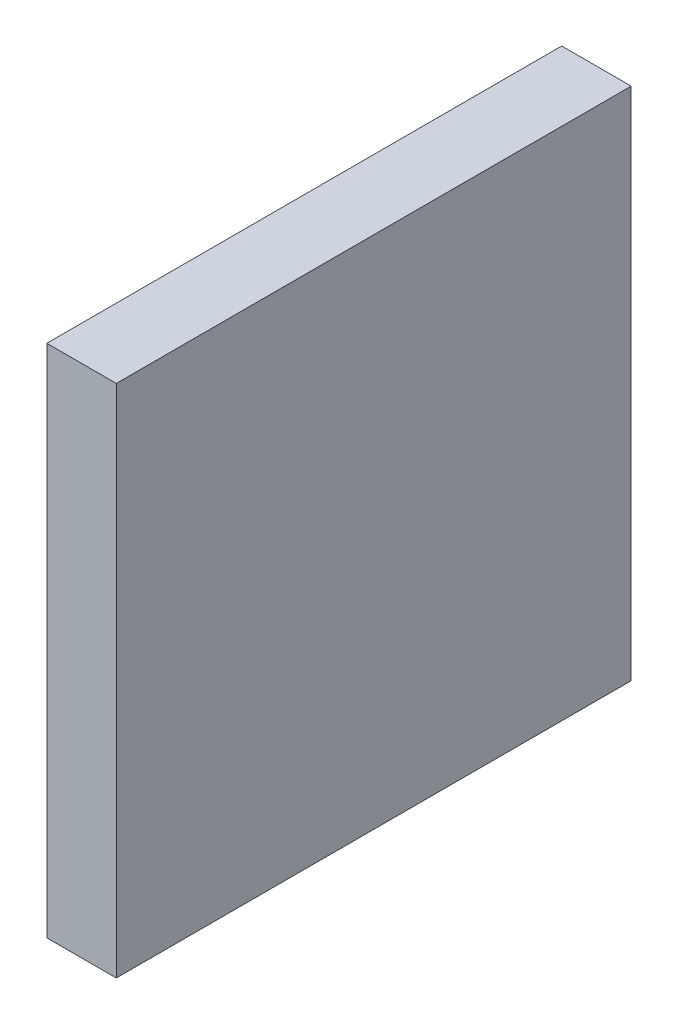
ISO-10303-21;
HEADER;
FILE_DESCRIPTION(('STEP AP214'),'2;1');
FILE_NAME('part.step','',(''),(''),'','','');
FILE_SCHEMA(('AUTOMOTIVE_DESIGN { 1 0 10303 214 1 1 1 1 }'));
ENDSEC;
DATA;
#1=APPLICATION_CONTEXT('core data for automotive mechanical design processes');
#2=APPLICATION_PROTOCOL_DEFINITION('international standard','automotive_design',2000,#1);
#3=PRODUCT_CONTEXT('',#1,'mechanical');
#4=PRODUCT('Part','Part','',(#3));
#5=PRODUCT_RELATED_PRODUCT_CATEGORY('part','',(#4));
#6=PRODUCT_DEFINITION_FORMATION('','',#4);
#7=PRODUCT_DEFINITION_CONTEXT('part definition',#1,'design');
#8=PRODUCT_DEFINITION('design','',#6,#7);
#9=PRODUCT_DEFINITION_SHAPE('','',#8);
#10=(LENGTH_UNIT() NAMED_UNIT(*) SI_UNIT(.MILLI.,.METRE.));
#11=(NAMED_UNIT(*) PLANE_ANGLE_UNIT() SI_UNIT($,.RADIAN.));
#12=(NAMED_UNIT(*) SI_UNIT($,.STERADIAN.) SOLID_ANGLE_UNIT());
#13=UNCERTAINTY_MEASURE_WITH_UNIT(LENGTH_MEASURE(1.E-05),#10,'distance_accuracy_value','');
#14=(GEOMETRIC_REPRESENTATION_CONTEXT(3) GLOBAL_UNCERTAINTY_ASSIGNED_CONTEXT((#13)) GLOBAL_UNIT_ASSIGNED_CONTEXT((#10,
#11,#12)) REPRESENTATION_CONTEXT('',''));
#15=CARTESIAN_POINT('',(0.,0.,0.));
#16=DIRECTION('',(0.,0.,1.));
#17=DIRECTION('',(1.,0.,0.));
#18=AXIS2_PLACEMENT_3D('',#15,#16,#17);
#19=CARTESIAN_POINT('',(42.8572096364506,20.4969615402409,-26.9568516781354));
#20=DIRECTION('',(1.,0.,0.));
#21=DIRECTION('',(0.,1.,0.));
#22=AXIS2_PLACEMENT_3D('',#19,#20,#21);
#23=PLANE('',#22);
#24=DIRECTION('',(0.,-1.,0.));
#25=VECTOR('',#24,1.);
#26=CARTESIAN_POINT('',(42.8572096364506,32.496960400241,-14.9568528181354));
#27=LINE('',#26,#25);
#28=CARTESIAN_POINT('',(42.8572096364506,32.496960400241,-14.9568528181354));
#29=VERTEX_POINT('',#28);
#30=CARTESIAN_POINT('',(42.8572096364506,20.496961540241,-14.9568528181353));
#31=VERTEX_POINT('',#30);
#32=EDGE_CURVE('E21',#29,#31,#27,.T.);
#33=ORIENTED_EDGE('',*,*,#32,.T.);
#34=DIRECTION('',(0.,0.,-1.));
#35=VECTOR('',#34,1.);
#36=CARTESIAN_POINT('',(42.8572096364506,20.4969615402409,-14.9568528181353));
#37=LINE('',#36,#35);
#38=CARTESIAN_POINT('',(42.8572096364506,20.4969615402409,-26.9568516781354));
#39=VERTEX_POINT('',#38);
#40=EDGE_CURVE('E11',#31,#39,#37,.T.);
#41=ORIENTED_EDGE('',*,*,#40,.T.);
#42=DIRECTION('',(0.,1.,0.));
#43=VECTOR('',#42,1.);
#44=CARTESIAN_POINT('',(42.8572096364506,32.4969604002409,-26.9568516781354));
#45=LINE('',#44,#43);
#46=CARTESIAN_POINT('',(42.8572096364506,32.4969604002409,-26.9568516781354));
#47=VERTEX_POINT('',#46);
#48=EDGE_CURVE('E88',#39,#47,#45,.T.);
#49=ORIENTED_EDGE('',*,*,#48,.T.);
#50=DIRECTION('',(0.,0.,1.));
#51=VECTOR('',#50,1.);
#52=CARTESIAN_POINT('',(42.8572096364506,32.4969604002409,-14.9568528181354));
#53=LINE('',#52,#51);
#54=EDGE_CURVE('E72',#47,#29,#53,.T.);
#55=ORIENTED_EDGE('',*,*,#54,.T.);
#56=EDGE_LOOP('',(#33,#41,#49,#55));
#57=FACE_BOUND('',#56,.T.);
#58=ADVANCED_FACE('F17',(#57),#23,.T.);
#59=CARTESIAN_POINT('',(41.2372103364507,20.4969615402409,-26.9568516781354));
#60=DIRECTION('',(0.,1.,0.));
#61=DIRECTION('',(0.,0.,-1.));
#62=AXIS2_PLACEMENT_3D('',#59,#60,#61);
#63=PLANE('',#62);
#64=ORIENTED_EDGE('',*,*,#40,.F.);
#65=DIRECTION('',(1.,0.,0.));
#66=VECTOR('',#65,1.);
#67=CARTESIAN_POINT('',(41.2372103364507,20.496961540241,-14.9568528181353));
#68=LINE('',#67,#66);
#69=CARTESIAN_POINT('',(41.2372103364507,20.496961540241,-14.9568528181353));
#70=VERTEX_POINT('',#69);
#71=EDGE_CURVE('E115',#70,#31,#68,.T.);
#72=ORIENTED_EDGE('',*,*,#71,.F.);
#73=DIRECTION('',(0.,0.,1.));
#74=VECTOR('',#73,1.);
#75=CARTESIAN_POINT('',(41.2372103364507,20.4969615402409,-14.9568528181353));
#76=LINE('',#75,#74);
#77=CARTESIAN_POINT('',(41.2372103364507,20.4969615402409,-26.9568516781354));
#78=VERTEX_POINT('',#77);
#79=EDGE_CURVE('E93',#78,#70,#76,.T.);
#80=ORIENTED_EDGE('',*,*,#79,.F.);
#81=DIRECTION('',(-1.,0.,0.));
#82=VECTOR('',#81,1.);
#83=CARTESIAN_POINT('',(41.2372103364507,20.4969615402409,-26.9568516781354));
#84=LINE('',#83,#82);
#85=EDGE_CURVE('E78',#39,#78,#84,.T.);
#86=ORIENTED_EDGE('',*,*,#85,.F.);
#87=EDGE_LOOP('',(#64,#72,#80,#86));
#88=FACE_BOUND('',#87,.T.);
#89=ADVANCED_FACE('F157',(#88),#63,.F.);
#90=CARTESIAN_POINT('',(42.8572096364506,20.496961540241,-14.9568528181353));
#91=DIRECTION('',(0.,0.,1.));
#92=DIRECTION('',(0.,-1.,0.));
#93=AXIS2_PLACEMENT_3D('',#90,#91,#92);
#94=PLANE('',#93);
#95=DIRECTION('',(0.,-1.,0.));
#96=VECTOR('',#95,1.);
#97=CARTESIAN_POINT('',(41.2372103364507,32.496960400241,-14.9568528181354));
#98=LINE('',#97,#96);
#99=CARTESIAN_POINT('',(41.2372103364507,32.496960400241,-14.9568528181354));
#100=VERTEX_POINT('',#99);
#101=EDGE_CURVE('E86',#100,#70,#98,.T.);
#102=ORIENTED_EDGE('',*,*,#101,.T.);
#103=ORIENTED_EDGE('',*,*,#71,.T.);
#104=ORIENTED_EDGE('',*,*,#32,.F.);
#105=DIRECTION('',(-1.,0.,0.));
#106=VECTOR('',#105,1.);
#107=CARTESIAN_POINT('',(41.2372103364507,32.496960400241,-14.9568528181354));
#108=LINE('',#107,#106);
#109=EDGE_CURVE('E113',#29,#100,#108,.T.);
#110=ORIENTED_EDGE('',*,*,#109,.T.);
#111=EDGE_LOOP('',(#102,#103,#104,#110));
#112=FACE_BOUND('',#111,.T.);
#113=ADVANCED_FACE('F122',(#112),#94,.T.);
#114=CARTESIAN_POINT('',(41.2372103364507,32.4969604002409,-26.9568516781354));
#115=DIRECTION('',(0.,1.,0.));
#116=DIRECTION('',(0.,0.,-1.));
#117=AXIS2_PLACEMENT_3D('',#114,#115,#116);
#118=PLANE('',#117);
#119=ORIENTED_EDGE('',*,*,#54,.F.);
#120=DIRECTION('',(-1.,0.,0.));
#121=VECTOR('',#120,1.);
#122=CARTESIAN_POINT('',(41.2372103364507,32.4969604002409,-26.9568516781354));
#123=LINE('',#122,#121);
#124=CARTESIAN_POINT('',(41.2372103364507,32.4969604002409,-26.9568516781354));
#125=VERTEX_POINT('',#124);
#126=EDGE_CURVE('E66',#47,#125,#123,.T.);
#127=ORIENTED_EDGE('',*,*,#126,.T.);
#128=DIRECTION('',(0.,0.,1.));
#129=VECTOR('',#128,1.);
#130=CARTESIAN_POINT('',(41.2372103364507,32.4969604002409,-14.9568528181354));
#131=LINE('',#130,#129);
#132=EDGE_CURVE('E69',#125,#100,#131,.T.);
#133=ORIENTED_EDGE('',*,*,#132,.T.);
#134=ORIENTED_EDGE('',*,*,#109,.F.);
#135=EDGE_LOOP('',(#119,#127,#133,#134));
#136=FACE_BOUND('',#135,.T.);
#137=ADVANCED_FACE('F19',(#136),#118,.T.);
#138=CARTESIAN_POINT('',(41.2372103364507,20.4969615402409,-26.9568516781354));
#139=DIRECTION('',(0.,0.,-1.));
#140=DIRECTION('',(0.,-1.,0.));
#141=AXIS2_PLACEMENT_3D('',#138,#139,#140);
#142=PLANE('',#141);
#143=ORIENTED_EDGE('',*,*,#48,.F.);
#144=ORIENTED_EDGE('',*,*,#85,.T.);
#145=DIRECTION('',(0.,1.,0.));
#146=VECTOR('',#145,1.);
#147=CARTESIAN_POINT('',(41.2372103364507,20.4969615402409,-26.9568516781354));
#148=LINE('',#147,#146);
#149=EDGE_CURVE('E84',#78,#125,#148,.T.);
#150=ORIENTED_EDGE('',*,*,#149,.T.);
#151=ORIENTED_EDGE('',*,*,#126,.F.);
#152=EDGE_LOOP('',(#143,#144,#150,#151));
#153=FACE_BOUND('',#152,.T.);
#154=ADVANCED_FACE('F90',(#153),#142,.T.);
#155=CARTESIAN_POINT('',(41.2372103364507,20.496961540241,-14.9568528181353));
#156=DIRECTION('',(-1.,0.,0.));
#157=DIRECTION('',(0.,0.,1.));
#158=AXIS2_PLACEMENT_3D('',#155,#156,#157);
#159=PLANE('',#158);
#160=ORIENTED_EDGE('',*,*,#149,.F.);
#161=ORIENTED_EDGE('',*,*,#79,.T.);
#162=ORIENTED_EDGE('',*,*,#101,.F.);
#163=ORIENTED_EDGE('',*,*,#132,.F.);
#164=EDGE_LOOP('',(#160,#161,#162,#163));
#165=FACE_BOUND('',#164,.T.);
#166=ADVANCED_FACE('F82',(#165),#159,.T.);
#167=CLOSED_SHELL('',(#58,#89,#113,#137,#154,#166));
#168=MANIFOLD_SOLID_BREP('B1',#167);
#169=ADVANCED_BREP_SHAPE_REPRESENTATION('',(#18,#168),#14);
#170=SHAPE_DEFINITION_REPRESENTATION(#9,#169);
ENDSEC;
END-ISO-10303-21;
